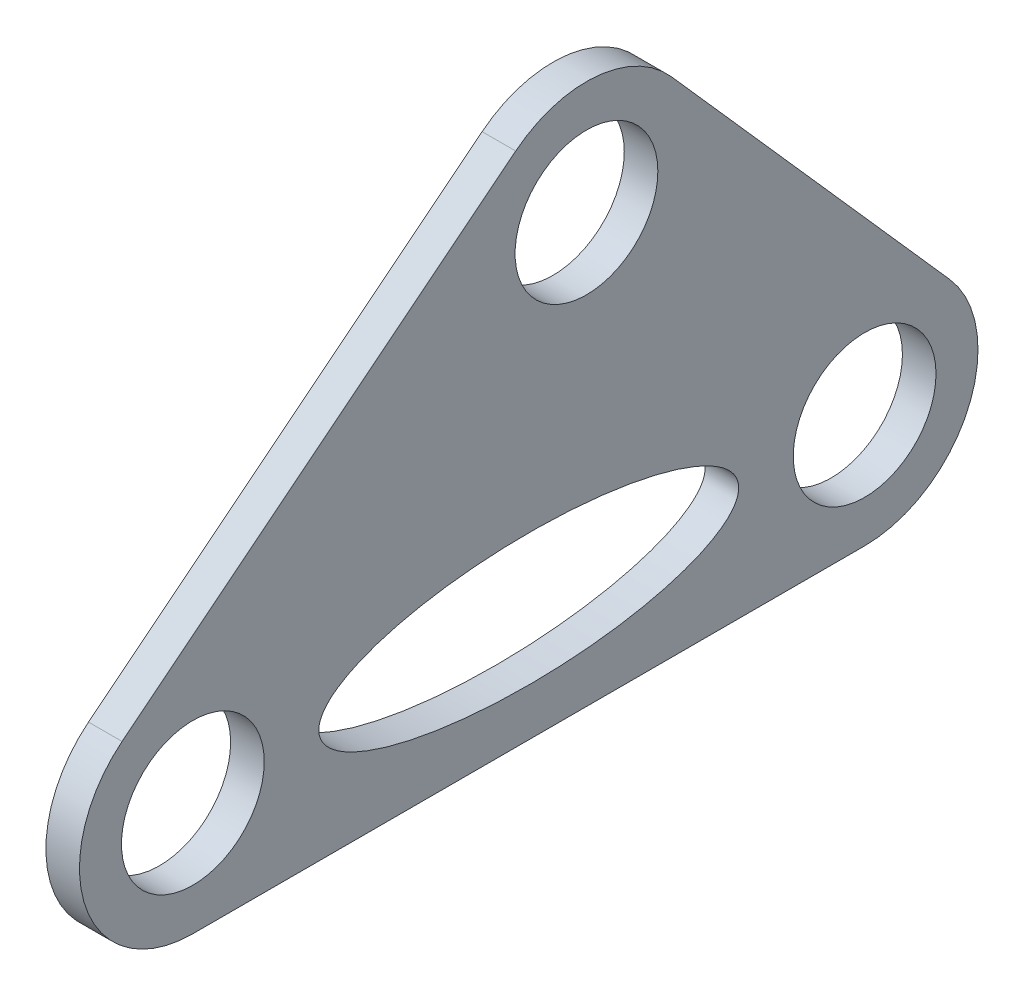
ISO-10303-21;
HEADER;
FILE_DESCRIPTION(('STEP AP214'),'2;1');
FILE_NAME('part.step','',(''),(''),'','','');
FILE_SCHEMA(('AUTOMOTIVE_DESIGN { 1 0 10303 214 1 1 1 1 }'));
ENDSEC;
DATA;
#1=APPLICATION_CONTEXT('core data for automotive mechanical design processes');
#2=APPLICATION_PROTOCOL_DEFINITION('international standard','automotive_design',2000,#1);
#3=PRODUCT_CONTEXT('',#1,'mechanical');
#4=PRODUCT('Part','Part','',(#3));
#5=PRODUCT_RELATED_PRODUCT_CATEGORY('part','',(#4));
#6=PRODUCT_DEFINITION_FORMATION('','',#4);
#7=PRODUCT_DEFINITION_CONTEXT('part definition',#1,'design');
#8=PRODUCT_DEFINITION('design','',#6,#7);
#9=PRODUCT_DEFINITION_SHAPE('','',#8);
#10=(LENGTH_UNIT() NAMED_UNIT(*) SI_UNIT(.MILLI.,.METRE.));
#11=(NAMED_UNIT(*) PLANE_ANGLE_UNIT() SI_UNIT($,.RADIAN.));
#12=(NAMED_UNIT(*) SI_UNIT($,.STERADIAN.) SOLID_ANGLE_UNIT());
#13=UNCERTAINTY_MEASURE_WITH_UNIT(LENGTH_MEASURE(1.E-05),#10,'distance_accuracy_value','');
#14=(GEOMETRIC_REPRESENTATION_CONTEXT(3) GLOBAL_UNCERTAINTY_ASSIGNED_CONTEXT((#13)) GLOBAL_UNIT_ASSIGNED_CONTEXT((#10,
#11,#12)) REPRESENTATION_CONTEXT('',''));
#15=CARTESIAN_POINT('',(0.,0.,0.));
#16=DIRECTION('',(0.,0.,1.));
#17=DIRECTION('',(1.,0.,0.));
#18=AXIS2_PLACEMENT_3D('',#15,#16,#17);
#19=CARTESIAN_POINT('',(4.,37.4530956664466,-46.875));
#20=DIRECTION('',(-1.,0.,0.));
#21=DIRECTION('',(0.,0.,1.));
#22=AXIS2_PLACEMENT_3D('',#19,#20,#21);
#23=CYLINDRICAL_SURFACE('',#22,13.5000000000125);
#24=CARTESIAN_POINT('',(0.,37.4530956664466,-46.875));
#25=DIRECTION('',(1.,0.,0.));
#26=DIRECTION('',(0.,0.,-1.));
#27=AXIS2_PLACEMENT_3D('',#24,#25,#26);
#28=CIRCLE('',#27,13.5000000000125);
#29=CARTESIAN_POINT('',(0.,47.9999706664546,-38.4480534750395));
#30=VERTEX_POINT('',#29);
#31=CARTESIAN_POINT('',(0.,46.3968456664524,-56.9873358299522));
#32=VERTEX_POINT('',#31);
#33=EDGE_CURVE('E133',#30,#32,#28,.F.);
#34=ORIENTED_EDGE('',*,*,#33,.F.);
#35=DIRECTION('',(-1.,0.,0.));
#36=VECTOR('',#35,1.);
#37=CARTESIAN_POINT('',(4.,47.9999706664546,-38.4480534750395));
#38=LINE('',#37,#36);
#39=CARTESIAN_POINT('',(4.,47.9999706664546,-38.4480534750395));
#40=VERTEX_POINT('',#39);
#41=EDGE_CURVE('E11',#40,#30,#38,.T.);
#42=ORIENTED_EDGE('',*,*,#41,.F.);
#43=CARTESIAN_POINT('',(4.,37.4530956664466,-46.875));
#44=DIRECTION('',(1.,0.,0.));
#45=DIRECTION('',(0.,0.,-1.));
#46=AXIS2_PLACEMENT_3D('',#43,#44,#45);
#47=CIRCLE('',#46,13.5000000000125);
#48=CARTESIAN_POINT('',(4.,46.3968456664524,-56.9873358299522));
#49=VERTEX_POINT('',#48);
#50=EDGE_CURVE('E156',#40,#49,#47,.F.);
#51=ORIENTED_EDGE('',*,*,#50,.T.);
#52=DIRECTION('',(-1.,0.,0.));
#53=VECTOR('',#52,1.);
#54=CARTESIAN_POINT('',(4.,46.3968456664524,-56.9873358299522));
#55=LINE('',#54,#53);
#56=EDGE_CURVE('E56',#49,#32,#55,.T.);
#57=ORIENTED_EDGE('',*,*,#56,.T.);
#58=EDGE_LOOP('',(#34,#42,#51,#57));
#59=FACE_BOUND('',#58,.T.);
#60=ADVANCED_FACE('F39',(#59),#23,.T.);
#61=CARTESIAN_POINT('',(4.,10.5468749999982,8.42694652495268));
#62=DIRECTION('',(0.,0.78124999999987,0.624218261107606));
#63=DIRECTION('',(0.,-0.624218261107606,0.78124999999987));
#64=AXIS2_PLACEMENT_3D('',#61,#62,#63);
#65=PLANE('',#64);
#66=DIRECTION('',(0.,0.624218261107606,-0.78124999999987));
#67=VECTOR('',#66,1.);
#68=CARTESIAN_POINT('',(0.,10.5468749999982,8.42694652495268));
#69=LINE('',#68,#67);
#70=CARTESIAN_POINT('',(0.,10.5468749999983,8.42694652495268));
#71=VERTEX_POINT('',#70);
#72=EDGE_CURVE('E135',#71,#30,#69,.T.);
#73=ORIENTED_EDGE('',*,*,#72,.F.);
#74=DIRECTION('',(-1.,0.,0.));
#75=VECTOR('',#74,1.);
#76=CARTESIAN_POINT('',(4.,10.5468749999983,8.42694652495268));
#77=LINE('',#76,#75);
#78=CARTESIAN_POINT('',(4.,10.5468749999983,8.42694652495268));
#79=VERTEX_POINT('',#78);
#80=EDGE_CURVE('E48',#79,#71,#77,.T.);
#81=ORIENTED_EDGE('',*,*,#80,.F.);
#82=DIRECTION('',(0.,0.624218261107606,-0.78124999999987));
#83=VECTOR('',#82,1.);
#84=CARTESIAN_POINT('',(4.,10.5468749999982,8.42694652495268));
#85=LINE('',#84,#83);
#86=EDGE_CURVE('E119',#79,#40,#85,.T.);
#87=ORIENTED_EDGE('',*,*,#86,.T.);
#88=ORIENTED_EDGE('',*,*,#41,.T.);
#89=EDGE_LOOP('',(#73,#81,#87,#88));
#90=FACE_BOUND('',#89,.T.);
#91=ADVANCED_FACE('F169',(#90),#65,.T.);
#92=CARTESIAN_POINT('',(4.,0.,0.));
#93=DIRECTION('',(-1.,0.,0.));
#94=DIRECTION('',(0.,0.,1.));
#95=AXIS2_PLACEMENT_3D('',#92,#93,#94);
#96=CYLINDRICAL_SURFACE('',#95,13.5);
#97=CARTESIAN_POINT('',(0.,0.,0.));
#98=DIRECTION('',(1.,0.,0.));
#99=DIRECTION('',(0.,0.,-1.));
#100=AXIS2_PLACEMENT_3D('',#97,#98,#99);
#101=CIRCLE('',#100,13.5);
#102=CARTESIAN_POINT('',(0.,-13.5,0.));
#103=VERTEX_POINT('',#102);
#104=EDGE_CURVE('E138',#71,#103,#101,.T.);
#105=ORIENTED_EDGE('',*,*,#104,.T.);
#106=DIRECTION('',(-1.,0.,0.));
#107=VECTOR('',#106,1.);
#108=CARTESIAN_POINT('',(4.,-13.5,0.));
#109=LINE('',#108,#107);
#110=CARTESIAN_POINT('',(4.,-13.5,0.));
#111=VERTEX_POINT('',#110);
#112=EDGE_CURVE('E104',#111,#103,#109,.T.);
#113=ORIENTED_EDGE('',*,*,#112,.F.);
#114=CARTESIAN_POINT('',(4.,0.,0.));
#115=DIRECTION('',(1.,0.,0.));
#116=DIRECTION('',(0.,0.,-1.));
#117=AXIS2_PLACEMENT_3D('',#114,#115,#116);
#118=CIRCLE('',#117,13.5);
#119=EDGE_CURVE('E116',#79,#111,#118,.T.);
#120=ORIENTED_EDGE('',*,*,#119,.F.);
#121=ORIENTED_EDGE('',*,*,#80,.T.);
#122=EDGE_LOOP('',(#105,#113,#120,#121));
#123=FACE_BOUND('',#122,.T.);
#124=ADVANCED_FACE('F162',(#123),#96,.T.);
#125=CARTESIAN_POINT('',(4.,-13.5,0.));
#126=DIRECTION('',(0.,-1.,0.));
#127=DIRECTION('',(0.,0.,-1.));
#128=AXIS2_PLACEMENT_3D('',#125,#126,#127);
#129=PLANE('',#128);
#130=DIRECTION('',(0.,0.,1.));
#131=VECTOR('',#130,1.);
#132=CARTESIAN_POINT('',(0.,-13.5,0.));
#133=LINE('',#132,#131);
#134=CARTESIAN_POINT('',(0.,-13.5,-80.));
#135=VERTEX_POINT('',#134);
#136=EDGE_CURVE('E101',#135,#103,#133,.T.);
#137=ORIENTED_EDGE('',*,*,#136,.F.);
#138=DIRECTION('',(-1.,0.,0.));
#139=VECTOR('',#138,1.);
#140=CARTESIAN_POINT('',(4.,-13.5,-80.));
#141=LINE('',#140,#139);
#142=CARTESIAN_POINT('',(4.,-13.5,-80.));
#143=VERTEX_POINT('',#142);
#144=EDGE_CURVE('E95',#143,#135,#141,.T.);
#145=ORIENTED_EDGE('',*,*,#144,.F.);
#146=DIRECTION('',(0.,0.,1.));
#147=VECTOR('',#146,1.);
#148=CARTESIAN_POINT('',(4.,-13.5,0.));
#149=LINE('',#148,#147);
#150=EDGE_CURVE('E99',#143,#111,#149,.T.);
#151=ORIENTED_EDGE('',*,*,#150,.T.);
#152=ORIENTED_EDGE('',*,*,#112,.T.);
#153=EDGE_LOOP('',(#137,#145,#151,#152));
#154=FACE_BOUND('',#153,.T.);
#155=ADVANCED_FACE('F97',(#154),#129,.T.);
#156=CARTESIAN_POINT('',(4.,0.,-80.));
#157=DIRECTION('',(-1.,0.,0.));
#158=DIRECTION('',(0.,0.,1.));
#159=AXIS2_PLACEMENT_3D('',#156,#157,#158);
#160=CYLINDRICAL_SURFACE('',#159,13.5);
#161=CARTESIAN_POINT('',(0.,0.,-80.));
#162=DIRECTION('',(1.,0.,0.));
#163=DIRECTION('',(0.,0.,-1.));
#164=AXIS2_PLACEMENT_3D('',#161,#162,#163);
#165=CIRCLE('',#164,13.5);
#166=CARTESIAN_POINT('',(0.,8.94374999999747,-90.1123358299428));
#167=VERTEX_POINT('',#166);
#168=EDGE_CURVE('E142',#135,#167,#165,.T.);
#169=ORIENTED_EDGE('',*,*,#168,.T.);
#170=DIRECTION('',(-1.,0.,0.));
#171=VECTOR('',#170,1.);
#172=CARTESIAN_POINT('',(4.,8.94374999999747,-90.1123358299428));
#173=LINE('',#172,#171);
#174=CARTESIAN_POINT('',(4.,8.94374999999747,-90.1123358299428));
#175=VERTEX_POINT('',#174);
#176=EDGE_CURVE('E76',#175,#167,#173,.T.);
#177=ORIENTED_EDGE('',*,*,#176,.F.);
#178=CARTESIAN_POINT('',(4.,0.,-80.));
#179=DIRECTION('',(1.,0.,0.));
#180=DIRECTION('',(0.,0.,-1.));
#181=AXIS2_PLACEMENT_3D('',#178,#179,#180);
#182=CIRCLE('',#181,13.5);
#183=EDGE_CURVE('E106',#143,#175,#182,.T.);
#184=ORIENTED_EDGE('',*,*,#183,.F.);
#185=ORIENTED_EDGE('',*,*,#144,.T.);
#186=EDGE_LOOP('',(#169,#177,#184,#185));
#187=FACE_BOUND('',#186,.T.);
#188=ADVANCED_FACE('F107',(#187),#160,.T.);
#189=CARTESIAN_POINT('',(4.,37.4530956664466,-46.875));
#190=DIRECTION('',(-1.,0.,0.));
#191=DIRECTION('',(0.,0.,1.));
#192=AXIS2_PLACEMENT_3D('',#189,#190,#191);
#193=CYLINDRICAL_SURFACE('',#192,8.5);
#194=CARTESIAN_POINT('',(4.,37.4530956664466,-46.875));
#195=DIRECTION('',(1.,0.,0.));
#196=DIRECTION('',(0.,0.,-1.));
#197=AXIS2_PLACEMENT_3D('',#194,#195,#196);
#198=CIRCLE('',#197,8.5);
#199=CARTESIAN_POINT('',(4.,37.4530956664466,-55.375));
#200=VERTEX_POINT('',#199);
#201=EDGE_CURVE('E127',#200,#200,#198,.T.);
#202=ORIENTED_EDGE('',*,*,#201,.T.);
#203=EDGE_LOOP('',(#202));
#204=FACE_BOUND('',#203,.T.);
#205=CARTESIAN_POINT('',(0.,37.4530956664466,-46.875));
#206=DIRECTION('',(1.,0.,0.));
#207=DIRECTION('',(0.,0.,-1.));
#208=AXIS2_PLACEMENT_3D('',#205,#206,#207);
#209=CIRCLE('',#208,8.5);
#210=CARTESIAN_POINT('',(0.,37.4530956664466,-55.375));
#211=VERTEX_POINT('',#210);
#212=EDGE_CURVE('E150',#211,#211,#209,.T.);
#213=ORIENTED_EDGE('',*,*,#212,.F.);
#214=EDGE_LOOP('',(#213));
#215=FACE_BOUND('',#214,.T.);
#216=ADVANCED_FACE('F181',(#204,#215),#193,.F.);
#217=CARTESIAN_POINT('',(4.,0.,-80.));
#218=DIRECTION('',(-1.,0.,0.));
#219=DIRECTION('',(0.,0.,1.));
#220=AXIS2_PLACEMENT_3D('',#217,#218,#219);
#221=CYLINDRICAL_SURFACE('',#220,8.5);
#222=CARTESIAN_POINT('',(4.,0.,-80.));
#223=DIRECTION('',(1.,0.,0.));
#224=DIRECTION('',(0.,0.,-1.));
#225=AXIS2_PLACEMENT_3D('',#222,#223,#224);
#226=CIRCLE('',#225,8.5);
#227=CARTESIAN_POINT('',(4.,0.,-88.5));
#228=VERTEX_POINT('',#227);
#229=EDGE_CURVE('E124',#228,#228,#226,.T.);
#230=ORIENTED_EDGE('',*,*,#229,.T.);
#231=EDGE_LOOP('',(#230));
#232=FACE_BOUND('',#231,.T.);
#233=CARTESIAN_POINT('',(0.,0.,-80.));
#234=DIRECTION('',(1.,0.,0.));
#235=DIRECTION('',(0.,0.,-1.));
#236=AXIS2_PLACEMENT_3D('',#233,#234,#235);
#237=CIRCLE('',#236,8.5);
#238=CARTESIAN_POINT('',(0.,0.,-88.5));
#239=VERTEX_POINT('',#238);
#240=EDGE_CURVE('E147',#239,#239,#237,.T.);
#241=ORIENTED_EDGE('',*,*,#240,.F.);
#242=EDGE_LOOP('',(#241));
#243=FACE_BOUND('',#242,.T.);
#244=ADVANCED_FACE('F173',(#232,#243),#221,.F.);
#245=CARTESIAN_POINT('',(4.,48.6440314064284,-54.9998358299627));
#246=DIRECTION('',(0.,0.662499999999813,-0.749061913329098));
#247=DIRECTION('',(0.,0.749061913329098,0.662499999999813));
#248=AXIS2_PLACEMENT_3D('',#245,#246,#247);
#249=PLANE('',#248);
#250=DIRECTION('',(0.,-0.749061913329098,-0.662499999999813));
#251=VECTOR('',#250,1.);
#252=CARTESIAN_POINT('',(0.,48.6440314064284,-54.9998358299627));
#253=LINE('',#252,#251);
#254=EDGE_CURVE('E144',#32,#167,#253,.T.);
#255=ORIENTED_EDGE('',*,*,#254,.F.);
#256=ORIENTED_EDGE('',*,*,#56,.F.);
#257=DIRECTION('',(0.,-0.749061913329098,-0.662499999999813));
#258=VECTOR('',#257,1.);
#259=CARTESIAN_POINT('',(4.,48.6440314064284,-54.9998358299627));
#260=LINE('',#259,#258);
#261=EDGE_CURVE('E110',#49,#175,#260,.T.);
#262=ORIENTED_EDGE('',*,*,#261,.T.);
#263=ORIENTED_EDGE('',*,*,#176,.T.);
#264=EDGE_LOOP('',(#255,#256,#262,#263));
#265=FACE_BOUND('',#264,.T.);
#266=ADVANCED_FACE('F170',(#265),#249,.T.);
#267=CARTESIAN_POINT('',(4.,0.,0.));
#268=DIRECTION('',(-1.,0.,0.));
#269=DIRECTION('',(0.,0.,1.));
#270=AXIS2_PLACEMENT_3D('',#267,#268,#269);
#271=CYLINDRICAL_SURFACE('',#270,8.5);
#272=CARTESIAN_POINT('',(4.,0.,0.));
#273=DIRECTION('',(1.,0.,0.));
#274=DIRECTION('',(0.,0.,-1.));
#275=AXIS2_PLACEMENT_3D('',#272,#273,#274);
#276=CIRCLE('',#275,8.5);
#277=CARTESIAN_POINT('',(4.,0.,-8.5));
#278=VERTEX_POINT('',#277);
#279=EDGE_CURVE('E130',#278,#278,#276,.T.);
#280=ORIENTED_EDGE('',*,*,#279,.T.);
#281=EDGE_LOOP('',(#280));
#282=FACE_BOUND('',#281,.T.);
#283=CARTESIAN_POINT('',(0.,0.,0.));
#284=DIRECTION('',(1.,0.,0.));
#285=DIRECTION('',(0.,0.,-1.));
#286=AXIS2_PLACEMENT_3D('',#283,#284,#285);
#287=CIRCLE('',#286,8.5);
#288=CARTESIAN_POINT('',(0.,0.,-8.5));
#289=VERTEX_POINT('',#288);
#290=EDGE_CURVE('E153',#289,#289,#287,.T.);
#291=ORIENTED_EDGE('',*,*,#290,.F.);
#292=EDGE_LOOP('',(#291));
#293=FACE_BOUND('',#292,.T.);
#294=ADVANCED_FACE('F172',(#282,#293),#271,.F.);
#295=CARTESIAN_POINT('',(4.,0.,0.));
#296=DIRECTION('',(1.,0.,0.));
#297=DIRECTION('',(0.,0.,-1.));
#298=AXIS2_PLACEMENT_3D('',#295,#296,#297);
#299=PLANE('',#298);
#300=CARTESIAN_POINT('',(4.,0.,-40.));
#301=DIRECTION('',(1.,0.,0.));
#302=DIRECTION('',(0.,0.,-1.));
#303=AXIS2_PLACEMENT_3D('',#300,#301,#302);
#304=ELLIPSE('',#303,25.,7.8486785424694);
#305=CARTESIAN_POINT('',(4.,0.,-65.));
#306=VERTEX_POINT('',#305);
#307=EDGE_CURVE('E217',#306,#306,#304,.T.);
#308=ORIENTED_EDGE('',*,*,#307,.F.);
#309=EDGE_LOOP('',(#308));
#310=FACE_BOUND('',#309,.T.);
#311=ORIENTED_EDGE('',*,*,#50,.F.);
#312=ORIENTED_EDGE('',*,*,#86,.F.);
#313=ORIENTED_EDGE('',*,*,#119,.T.);
#314=ORIENTED_EDGE('',*,*,#150,.F.);
#315=ORIENTED_EDGE('',*,*,#183,.T.);
#316=ORIENTED_EDGE('',*,*,#261,.F.);
#317=EDGE_LOOP('',(#311,#312,#313,#314,#315,#316));
#318=FACE_BOUND('',#317,.T.);
#319=ORIENTED_EDGE('',*,*,#229,.F.);
#320=EDGE_LOOP('',(#319));
#321=FACE_BOUND('',#320,.T.);
#322=ORIENTED_EDGE('',*,*,#201,.F.);
#323=EDGE_LOOP('',(#322));
#324=FACE_BOUND('',#323,.T.);
#325=ORIENTED_EDGE('',*,*,#279,.F.);
#326=EDGE_LOOP('',(#325));
#327=FACE_BOUND('',#326,.T.);
#328=ADVANCED_FACE('F112',(#310,#318,#321,#324,#327),#299,.T.);
#329=CARTESIAN_POINT('',(0.,0.,0.));
#330=DIRECTION('',(1.,0.,0.));
#331=DIRECTION('',(0.,0.,-1.));
#332=AXIS2_PLACEMENT_3D('',#329,#330,#331);
#333=PLANE('',#332);
#334=CARTESIAN_POINT('',(0.,0.,-40.));
#335=DIRECTION('',(1.,0.,0.));
#336=DIRECTION('',(0.,0.,-1.));
#337=AXIS2_PLACEMENT_3D('',#334,#335,#336);
#338=ELLIPSE('',#337,25.,7.8486785424694);
#339=CARTESIAN_POINT('',(0.,0.,-65.));
#340=VERTEX_POINT('',#339);
#341=EDGE_CURVE('E42',#340,#340,#338,.T.);
#342=ORIENTED_EDGE('',*,*,#341,.T.);
#343=EDGE_LOOP('',(#342));
#344=FACE_BOUND('',#343,.T.);
#345=ORIENTED_EDGE('',*,*,#33,.T.);
#346=ORIENTED_EDGE('',*,*,#254,.T.);
#347=ORIENTED_EDGE('',*,*,#168,.F.);
#348=ORIENTED_EDGE('',*,*,#136,.T.);
#349=ORIENTED_EDGE('',*,*,#104,.F.);
#350=ORIENTED_EDGE('',*,*,#72,.T.);
#351=EDGE_LOOP('',(#345,#346,#347,#348,#349,#350));
#352=FACE_BOUND('',#351,.T.);
#353=ORIENTED_EDGE('',*,*,#240,.T.);
#354=EDGE_LOOP('',(#353));
#355=FACE_BOUND('',#354,.T.);
#356=ORIENTED_EDGE('',*,*,#212,.T.);
#357=EDGE_LOOP('',(#356));
#358=FACE_BOUND('',#357,.T.);
#359=ORIENTED_EDGE('',*,*,#290,.T.);
#360=EDGE_LOOP('',(#359));
#361=FACE_BOUND('',#360,.T.);
#362=ADVANCED_FACE('F167',(#344,#352,#355,#358,#361),#333,.F.);
#363=CARTESIAN_POINT('',(-6.,0.,-40.));
#364=DIRECTION('',(1.,0.,0.));
#365=DIRECTION('',(0.,0.,-1.));
#366=AXIS2_PLACEMENT_3D('',#363,#364,#365);
#367=ELLIPSE('',#366,25.,7.8486785424694);
#368=DIRECTION('',(1.,0.,0.));
#369=VECTOR('',#368,1.);
#370=SURFACE_OF_LINEAR_EXTRUSION('',#367,#369);
#371=ORIENTED_EDGE('',*,*,#307,.T.);
#372=EDGE_LOOP('',(#371));
#373=FACE_BOUND('',#372,.T.);
#374=ORIENTED_EDGE('',*,*,#341,.F.);
#375=EDGE_LOOP('',(#374));
#376=FACE_BOUND('',#375,.T.);
#377=ADVANCED_FACE('F207',(#373,#376),#370,.F.);
#378=CLOSED_SHELL('',(#60,#91,#124,#155,#188,#216,#244,#266,#294,#328,#362,#377));
#379=MANIFOLD_SOLID_BREP('B2',#378);
#380=ADVANCED_BREP_SHAPE_REPRESENTATION('',(#18,#379),#14);
#381=SHAPE_DEFINITION_REPRESENTATION(#9,#380);
ENDSEC;
END-ISO-10303-21;
